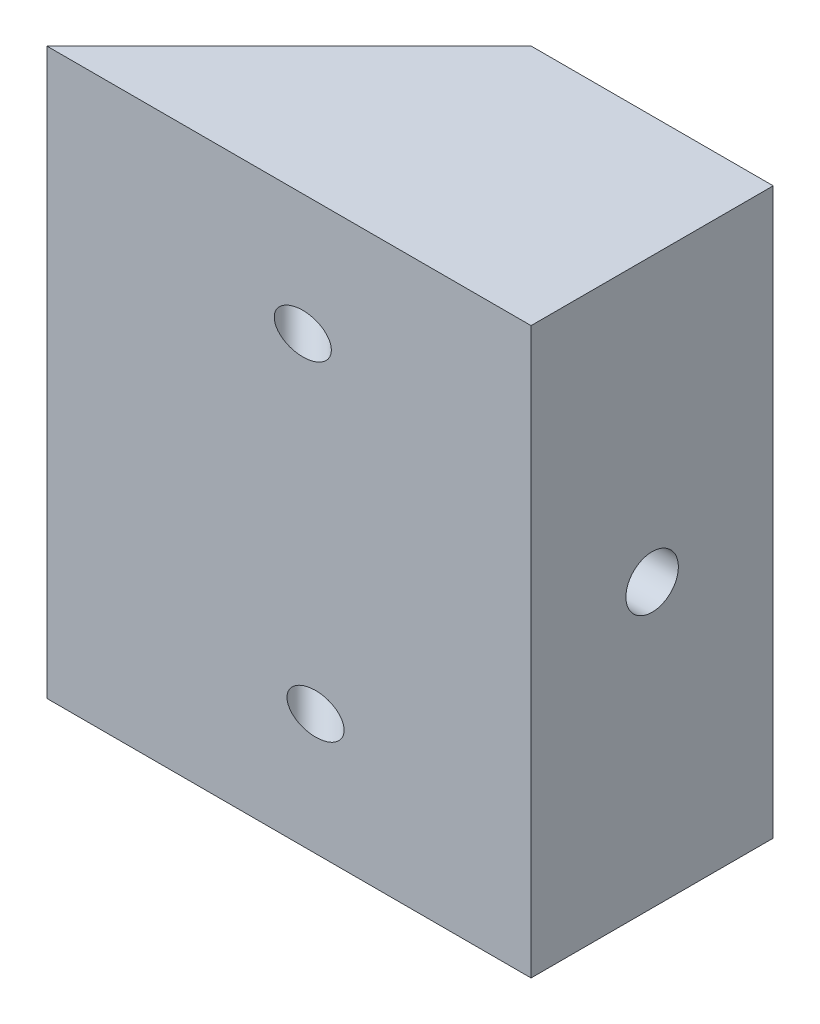
ISO-10303-21;
HEADER;
FILE_DESCRIPTION(('STEP AP214'),'2;1');
FILE_NAME('part.step','',(''),(''),'','','');
FILE_SCHEMA(('AUTOMOTIVE_DESIGN { 1 0 10303 214 1 1 1 1 }'));
ENDSEC;
DATA;
#1=APPLICATION_CONTEXT('core data for automotive mechanical design processes');
#2=APPLICATION_PROTOCOL_DEFINITION('international standard','automotive_design',2000,#1);
#3=PRODUCT_CONTEXT('',#1,'mechanical');
#4=PRODUCT('Part','Part','',(#3));
#5=PRODUCT_RELATED_PRODUCT_CATEGORY('part','',(#4));
#6=PRODUCT_DEFINITION_FORMATION('','',#4);
#7=PRODUCT_DEFINITION_CONTEXT('part definition',#1,'design');
#8=PRODUCT_DEFINITION('design','',#6,#7);
#9=PRODUCT_DEFINITION_SHAPE('','',#8);
#10=(LENGTH_UNIT() NAMED_UNIT(*) SI_UNIT(.MILLI.,.METRE.));
#11=(NAMED_UNIT(*) PLANE_ANGLE_UNIT() SI_UNIT($,.RADIAN.));
#12=(NAMED_UNIT(*) SI_UNIT($,.STERADIAN.) SOLID_ANGLE_UNIT());
#13=UNCERTAINTY_MEASURE_WITH_UNIT(LENGTH_MEASURE(1.E-05),#10,'distance_accuracy_value','');
#14=(GEOMETRIC_REPRESENTATION_CONTEXT(3) GLOBAL_UNCERTAINTY_ASSIGNED_CONTEXT((#13)) GLOBAL_UNIT_ASSIGNED_CONTEXT((#10,
#11,#12)) REPRESENTATION_CONTEXT('',''));
#15=CARTESIAN_POINT('',(0.,0.,0.));
#16=DIRECTION('',(0.,0.,1.));
#17=DIRECTION('',(1.,0.,0.));
#18=AXIS2_PLACEMENT_3D('',#15,#16,#17);
#19=CARTESIAN_POINT('',(76.2,88.9,0.));
#20=DIRECTION('',(0.,0.,-1.));
#21=DIRECTION('',(-1.,0.,0.));
#22=AXIS2_PLACEMENT_3D('',#19,#20,#21);
#23=PLANE('',#22);
#24=CARTESIAN_POINT('',(40.2789755157233,69.85,0.));
#25=DIRECTION('',(0.,0.,-1.));
#26=DIRECTION('',(1.,0.,0.));
#27=AXIS2_PLACEMENT_3D('',#24,#25,#26);
#28=ELLIPSE('',#27,4.49012806053459,3.17500000000001);
#29=CARTESIAN_POINT('',(44.7691035762579,69.85,0.));
#30=VERTEX_POINT('',#29);
#31=EDGE_CURVE('E37',#30,#30,#28,.F.);
#32=ORIENTED_EDGE('',*,*,#31,.F.);
#33=EDGE_LOOP('',(#32));
#34=FACE_BOUND('',#33,.T.);
#35=CARTESIAN_POINT('',(42.2874812706589,19.05,0.));
#36=DIRECTION('',(0.,0.,-1.));
#37=DIRECTION('',(1.,0.,0.));
#38=AXIS2_PLACEMENT_3D('',#35,#36,#37);
#39=ELLIPSE('',#38,4.49012806053459,3.175);
#40=CARTESIAN_POINT('',(46.7776093311935,19.05,0.));
#41=VERTEX_POINT('',#40);
#42=EDGE_CURVE('E107',#41,#41,#39,.F.);
#43=ORIENTED_EDGE('',*,*,#42,.F.);
#44=EDGE_LOOP('',(#43));
#45=FACE_BOUND('',#44,.T.);
#46=DIRECTION('',(1.,0.,0.));
#47=VECTOR('',#46,1.);
#48=CARTESIAN_POINT('',(76.2,0.,0.));
#49=LINE('',#48,#47);
#50=CARTESIAN_POINT('',(0.,0.,0.));
#51=VERTEX_POINT('',#50);
#52=CARTESIAN_POINT('',(76.2,0.,0.));
#53=VERTEX_POINT('',#52);
#54=EDGE_CURVE('E100',#51,#53,#49,.T.);
#55=ORIENTED_EDGE('',*,*,#54,.T.);
#56=DIRECTION('',(0.,-1.,0.));
#57=VECTOR('',#56,1.);
#58=CARTESIAN_POINT('',(76.2,88.9,0.));
#59=LINE('',#58,#57);
#60=CARTESIAN_POINT('',(76.2,88.9,0.));
#61=VERTEX_POINT('',#60);
#62=EDGE_CURVE('E11',#61,#53,#59,.T.);
#63=ORIENTED_EDGE('',*,*,#62,.F.);
#64=DIRECTION('',(1.,0.,0.));
#65=VECTOR('',#64,1.);
#66=CARTESIAN_POINT('',(76.2,88.9,0.));
#67=LINE('',#66,#65);
#68=CARTESIAN_POINT('',(0.,88.9,0.));
#69=VERTEX_POINT('',#68);
#70=EDGE_CURVE('E87',#69,#61,#67,.T.);
#71=ORIENTED_EDGE('',*,*,#70,.F.);
#72=DIRECTION('',(0.,-1.,0.));
#73=VECTOR('',#72,1.);
#74=CARTESIAN_POINT('',(0.,88.9,0.));
#75=LINE('',#74,#73);
#76=EDGE_CURVE('E96',#69,#51,#75,.T.);
#77=ORIENTED_EDGE('',*,*,#76,.T.);
#78=EDGE_LOOP('',(#55,#63,#71,#77));
#79=FACE_BOUND('',#78,.T.);
#80=ADVANCED_FACE('F34',(#34,#45,#79),#23,.F.);
#81=CARTESIAN_POINT('',(76.2,88.9,-38.1));
#82=DIRECTION('',(-1.,0.,0.));
#83=DIRECTION('',(0.,0.,1.));
#84=AXIS2_PLACEMENT_3D('',#81,#82,#83);
#85=PLANE('',#84);
#86=CARTESIAN_POINT('',(76.2,44.45,-19.05));
#87=DIRECTION('',(1.,0.,0.));
#88=DIRECTION('',(0.,0.,-1.));
#89=AXIS2_PLACEMENT_3D('',#86,#87,#88);
#90=CIRCLE('',#89,4.1275);
#91=CARTESIAN_POINT('',(76.2,44.45,-23.1775));
#92=VERTEX_POINT('',#91);
#93=EDGE_CURVE('E122',#92,#92,#90,.T.);
#94=ORIENTED_EDGE('',*,*,#93,.F.);
#95=EDGE_LOOP('',(#94));
#96=FACE_BOUND('',#95,.T.);
#97=DIRECTION('',(0.,0.,-1.));
#98=VECTOR('',#97,1.);
#99=CARTESIAN_POINT('',(76.2,0.,-38.1));
#100=LINE('',#99,#98);
#101=CARTESIAN_POINT('',(76.2,0.,-38.1));
#102=VERTEX_POINT('',#101);
#103=EDGE_CURVE('E91',#53,#102,#100,.T.);
#104=ORIENTED_EDGE('',*,*,#103,.T.);
#105=DIRECTION('',(0.,-1.,0.));
#106=VECTOR('',#105,1.);
#107=CARTESIAN_POINT('',(76.2,88.9,-38.1));
#108=LINE('',#107,#106);
#109=CARTESIAN_POINT('',(76.2,88.9,-38.1));
#110=VERTEX_POINT('',#109);
#111=EDGE_CURVE('E43',#110,#102,#108,.T.);
#112=ORIENTED_EDGE('',*,*,#111,.F.);
#113=DIRECTION('',(0.,0.,-1.));
#114=VECTOR('',#113,1.);
#115=CARTESIAN_POINT('',(76.2,88.9,-38.1));
#116=LINE('',#115,#114);
#117=EDGE_CURVE('E82',#61,#110,#116,.T.);
#118=ORIENTED_EDGE('',*,*,#117,.F.);
#119=ORIENTED_EDGE('',*,*,#62,.T.);
#120=EDGE_LOOP('',(#104,#112,#118,#119));
#121=FACE_BOUND('',#120,.T.);
#122=ADVANCED_FACE('F90',(#96,#121),#85,.F.);
#123=CARTESIAN_POINT('',(38.0999999999999,88.9,-38.1));
#124=DIRECTION('',(0.,0.,1.));
#125=DIRECTION('',(1.,0.,0.));
#126=AXIS2_PLACEMENT_3D('',#123,#124,#125);
#127=PLANE('',#126);
#128=DIRECTION('',(-1.,0.,0.));
#129=VECTOR('',#128,1.);
#130=CARTESIAN_POINT('',(38.0999999999999,0.,-38.1));
#131=LINE('',#130,#129);
#132=CARTESIAN_POINT('',(38.0999999999999,0.,-38.1));
#133=VERTEX_POINT('',#132);
#134=EDGE_CURVE('E69',#102,#133,#131,.T.);
#135=ORIENTED_EDGE('',*,*,#134,.T.);
#136=DIRECTION('',(0.,-1.,0.));
#137=VECTOR('',#136,1.);
#138=CARTESIAN_POINT('',(38.0999999999999,88.9,-38.1));
#139=LINE('',#138,#137);
#140=CARTESIAN_POINT('',(38.0999999999999,88.9,-38.1));
#141=VERTEX_POINT('',#140);
#142=EDGE_CURVE('E92',#141,#133,#139,.T.);
#143=ORIENTED_EDGE('',*,*,#142,.F.);
#144=DIRECTION('',(-1.,0.,0.));
#145=VECTOR('',#144,1.);
#146=CARTESIAN_POINT('',(38.0999999999999,88.9,-38.1));
#147=LINE('',#146,#145);
#148=EDGE_CURVE('E85',#110,#141,#147,.T.);
#149=ORIENTED_EDGE('',*,*,#148,.F.);
#150=ORIENTED_EDGE('',*,*,#111,.T.);
#151=EDGE_LOOP('',(#135,#143,#149,#150));
#152=FACE_BOUND('',#151,.T.);
#153=ADVANCED_FACE('F94',(#152),#127,.F.);
#154=CARTESIAN_POINT('',(0.,88.9,0.));
#155=DIRECTION('',(0.707106781186549,0.,0.707106781186546));
#156=DIRECTION('',(0.707106781186546,0.,-0.707106781186549));
#157=AXIS2_PLACEMENT_3D('',#154,#155,#156);
#158=PLANE('',#157);
#159=DIRECTION('',(-0.707106781186546,0.,0.707106781186549));
#160=VECTOR('',#159,1.);
#161=CARTESIAN_POINT('',(0.,0.,0.));
#162=LINE('',#161,#160);
#163=EDGE_CURVE('E75',#133,#51,#162,.T.);
#164=ORIENTED_EDGE('',*,*,#163,.T.);
#165=ORIENTED_EDGE('',*,*,#76,.F.);
#166=DIRECTION('',(-0.707106781186546,0.,0.707106781186549));
#167=VECTOR('',#166,1.);
#168=CARTESIAN_POINT('',(0.,88.9,0.));
#169=LINE('',#168,#167);
#170=EDGE_CURVE('E52',#141,#69,#169,.T.);
#171=ORIENTED_EDGE('',*,*,#170,.F.);
#172=ORIENTED_EDGE('',*,*,#142,.T.);
#173=EDGE_LOOP('',(#164,#165,#171,#172));
#174=FACE_BOUND('',#173,.T.);
#175=ADVANCED_FACE('F142',(#174),#158,.F.);
#176=CARTESIAN_POINT('',(0.,88.9,0.));
#177=DIRECTION('',(0.,1.,0.));
#178=DIRECTION('',(0.,0.,1.));
#179=AXIS2_PLACEMENT_3D('',#176,#177,#178);
#180=PLANE('',#179);
#181=ORIENTED_EDGE('',*,*,#70,.T.);
#182=ORIENTED_EDGE('',*,*,#117,.T.);
#183=ORIENTED_EDGE('',*,*,#148,.T.);
#184=ORIENTED_EDGE('',*,*,#170,.T.);
#185=EDGE_LOOP('',(#181,#182,#183,#184));
#186=FACE_BOUND('',#185,.T.);
#187=ADVANCED_FACE('F83',(#186),#180,.T.);
#188=CARTESIAN_POINT('',(0.,0.,0.));
#189=DIRECTION('',(0.,1.,0.));
#190=DIRECTION('',(0.,0.,1.));
#191=AXIS2_PLACEMENT_3D('',#188,#189,#190);
#192=PLANE('',#191);
#193=ORIENTED_EDGE('',*,*,#54,.F.);
#194=ORIENTED_EDGE('',*,*,#163,.F.);
#195=ORIENTED_EDGE('',*,*,#134,.F.);
#196=ORIENTED_EDGE('',*,*,#103,.F.);
#197=EDGE_LOOP('',(#193,#194,#195,#196));
#198=FACE_BOUND('',#197,.T.);
#199=ADVANCED_FACE('F148',(#198),#192,.F.);
#200=CARTESIAN_POINT('',(32.302972272122,19.05,-9.98450899853686));
#201=DIRECTION('',(0.707106781186549,0.,0.707106781186546));
#202=DIRECTION('',(0.707106781186546,0.,-0.707106781186549));
#203=AXIS2_PLACEMENT_3D('',#200,#201,#202);
#204=CYLINDRICAL_SURFACE('',#203,3.175);
#205=CARTESIAN_POINT('',(32.302972272122,19.05,-9.98450899853686));
#206=DIRECTION('',(-0.707106781186549,0.,-0.707106781186546));
#207=DIRECTION('',(-0.707106781186546,0.,0.707106781186549));
#208=AXIS2_PLACEMENT_3D('',#205,#206,#207);
#209=CIRCLE('',#208,3.175);
#210=CARTESIAN_POINT('',(30.0579082418547,19.05,-7.73944496826956));
#211=VERTEX_POINT('',#210);
#212=EDGE_CURVE('E114',#211,#211,#209,.T.);
#213=ORIENTED_EDGE('',*,*,#212,.T.);
#214=EDGE_LOOP('',(#213));
#215=FACE_BOUND('',#214,.T.);
#216=ORIENTED_EDGE('',*,*,#42,.T.);
#217=EDGE_LOOP('',(#216));
#218=FACE_BOUND('',#217,.T.);
#219=ADVANCED_FACE('F151',(#215,#218),#204,.F.);
#220=CARTESIAN_POINT('',(32.302972272122,19.05,-9.98450899853686));
#221=DIRECTION('',(-0.707106781186549,0.,-0.707106781186546));
#222=DIRECTION('',(-0.707106781186546,0.,0.707106781186549));
#223=AXIS2_PLACEMENT_3D('',#220,#221,#222);
#224=PLANE('',#223);
#225=ORIENTED_EDGE('',*,*,#212,.F.);
#226=EDGE_LOOP('',(#225));
#227=FACE_BOUND('',#226,.T.);
#228=ADVANCED_FACE('F157',(#227),#224,.F.);
#229=CARTESIAN_POINT('',(31.2987193946542,69.85,-8.98025612106906));
#230=DIRECTION('',(0.707106781186549,0.,0.707106781186546));
#231=DIRECTION('',(0.707106781186546,0.,-0.707106781186549));
#232=AXIS2_PLACEMENT_3D('',#229,#230,#231);
#233=CYLINDRICAL_SURFACE('',#232,3.17500000000001);
#234=CARTESIAN_POINT('',(31.2987193946542,69.85,-8.98025612106906));
#235=DIRECTION('',(-0.707106781186549,0.,-0.707106781186546));
#236=DIRECTION('',(-0.707106781186546,0.,0.707106781186549));
#237=AXIS2_PLACEMENT_3D('',#234,#235,#236);
#238=CIRCLE('',#237,3.17500000000001);
#239=CARTESIAN_POINT('',(29.0536553643869,69.85,-6.73519209080176));
#240=VERTEX_POINT('',#239);
#241=EDGE_CURVE('E109',#240,#240,#238,.T.);
#242=ORIENTED_EDGE('',*,*,#241,.T.);
#243=EDGE_LOOP('',(#242));
#244=FACE_BOUND('',#243,.T.);
#245=ORIENTED_EDGE('',*,*,#31,.T.);
#246=EDGE_LOOP('',(#245));
#247=FACE_BOUND('',#246,.T.);
#248=ADVANCED_FACE('F161',(#244,#247),#233,.F.);
#249=CARTESIAN_POINT('',(31.2987193946542,69.85,-8.98025612106906));
#250=DIRECTION('',(-0.707106781186549,0.,-0.707106781186546));
#251=DIRECTION('',(-0.707106781186546,0.,0.707106781186549));
#252=AXIS2_PLACEMENT_3D('',#249,#250,#251);
#253=PLANE('',#252);
#254=ORIENTED_EDGE('',*,*,#241,.F.);
#255=EDGE_LOOP('',(#254));
#256=FACE_BOUND('',#255,.T.);
#257=ADVANCED_FACE('F133',(#256),#253,.F.);
#258=CARTESIAN_POINT('',(50.8,44.45,-19.05));
#259=DIRECTION('',(1.,0.,0.));
#260=DIRECTION('',(0.,0.,-1.));
#261=AXIS2_PLACEMENT_3D('',#258,#259,#260);
#262=CYLINDRICAL_SURFACE('',#261,4.1275);
#263=CARTESIAN_POINT('',(50.8,44.45,-19.05));
#264=DIRECTION('',(1.,0.,0.));
#265=DIRECTION('',(0.,0.,-1.));
#266=AXIS2_PLACEMENT_3D('',#263,#264,#265);
#267=CIRCLE('',#266,4.1275);
#268=CARTESIAN_POINT('',(50.8,44.45,-23.1775));
#269=VERTEX_POINT('',#268);
#270=EDGE_CURVE('E119',#269,#269,#267,.T.);
#271=ORIENTED_EDGE('',*,*,#270,.F.);
#272=EDGE_LOOP('',(#271));
#273=FACE_BOUND('',#272,.T.);
#274=ORIENTED_EDGE('',*,*,#93,.T.);
#275=EDGE_LOOP('',(#274));
#276=FACE_BOUND('',#275,.T.);
#277=ADVANCED_FACE('F130',(#273,#276),#262,.F.);
#278=CARTESIAN_POINT('',(50.8,44.45,-19.05));
#279=DIRECTION('',(1.,0.,0.));
#280=DIRECTION('',(0.,0.,-1.));
#281=AXIS2_PLACEMENT_3D('',#278,#279,#280);
#282=PLANE('',#281);
#283=ORIENTED_EDGE('',*,*,#270,.T.);
#284=EDGE_LOOP('',(#283));
#285=FACE_BOUND('',#284,.T.);
#286=ADVANCED_FACE('F128',(#285),#282,.T.);
#287=CLOSED_SHELL('',(#80,#122,#153,#175,#187,#199,#219,#228,#248,#257,#277,#286));
#288=MANIFOLD_SOLID_BREP('B2',#287);
#289=ADVANCED_BREP_SHAPE_REPRESENTATION('',(#18,#288),#14);
#290=SHAPE_DEFINITION_REPRESENTATION(#9,#289);
ENDSEC;
END-ISO-10303-21;
